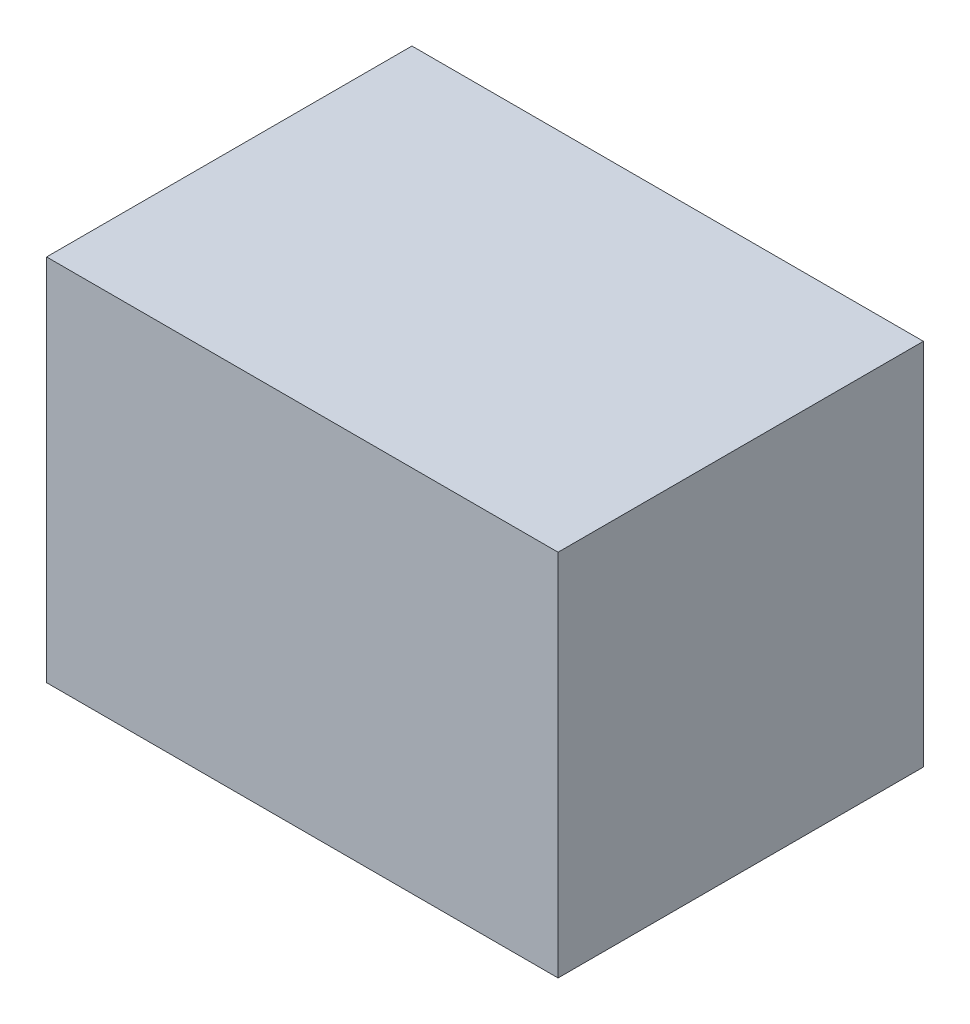
ISO-10303-21;
HEADER;
FILE_DESCRIPTION(('STEP AP214'),'2;1');
FILE_NAME('part.step','',(''),(''),'','','');
FILE_SCHEMA(('AUTOMOTIVE_DESIGN { 1 0 10303 214 1 1 1 1 }'));
ENDSEC;
DATA;
#1=APPLICATION_CONTEXT('core data for automotive mechanical design processes');
#2=APPLICATION_PROTOCOL_DEFINITION('international standard','automotive_design',2000,#1);
#3=PRODUCT_CONTEXT('',#1,'mechanical');
#4=PRODUCT('Part','Part','',(#3));
#5=PRODUCT_RELATED_PRODUCT_CATEGORY('part','',(#4));
#6=PRODUCT_DEFINITION_FORMATION('','',#4);
#7=PRODUCT_DEFINITION_CONTEXT('part definition',#1,'design');
#8=PRODUCT_DEFINITION('design','',#6,#7);
#9=PRODUCT_DEFINITION_SHAPE('','',#8);
#10=(LENGTH_UNIT() NAMED_UNIT(*) SI_UNIT(.MILLI.,.METRE.));
#11=(NAMED_UNIT(*) PLANE_ANGLE_UNIT() SI_UNIT($,.RADIAN.));
#12=(NAMED_UNIT(*) SI_UNIT($,.STERADIAN.) SOLID_ANGLE_UNIT());
#13=UNCERTAINTY_MEASURE_WITH_UNIT(LENGTH_MEASURE(1.E-05),#10,'distance_accuracy_value','');
#14=(GEOMETRIC_REPRESENTATION_CONTEXT(3) GLOBAL_UNCERTAINTY_ASSIGNED_CONTEXT((#13)) GLOBAL_UNIT_ASSIGNED_CONTEXT((#10,
#11,#12)) REPRESENTATION_CONTEXT('',''));
#15=CARTESIAN_POINT('',(0.,0.,0.));
#16=DIRECTION('',(0.,0.,1.));
#17=DIRECTION('',(1.,0.,0.));
#18=AXIS2_PLACEMENT_3D('',#15,#16,#17);
#19=CARTESIAN_POINT('',(52.5,75.7,-37.5));
#20=DIRECTION('',(-1.,0.,0.));
#21=DIRECTION('',(0.,0.,1.));
#22=AXIS2_PLACEMENT_3D('',#19,#20,#21);
#23=PLANE('',#22);
#24=DIRECTION('',(0.,0.,-1.));
#25=VECTOR('',#24,1.);
#26=CARTESIAN_POINT('',(52.5,0.,-37.5));
#27=LINE('',#26,#25);
#28=CARTESIAN_POINT('',(52.5,0.,37.5));
#29=VERTEX_POINT('',#28);
#30=CARTESIAN_POINT('',(52.5,0.,-37.5));
#31=VERTEX_POINT('',#30);
#32=EDGE_CURVE('E119',#29,#31,#27,.T.);
#33=ORIENTED_EDGE('',*,*,#32,.T.);
#34=DIRECTION('',(0.,-1.,0.));
#35=VECTOR('',#34,1.);
#36=CARTESIAN_POINT('',(52.5,75.7,-37.5));
#37=LINE('',#36,#35);
#38=CARTESIAN_POINT('',(52.5,75.7,-37.5));
#39=VERTEX_POINT('',#38);
#40=EDGE_CURVE('E11',#39,#31,#37,.T.);
#41=ORIENTED_EDGE('',*,*,#40,.F.);
#42=DIRECTION('',(0.,0.,-1.));
#43=VECTOR('',#42,1.);
#44=CARTESIAN_POINT('',(52.5,75.7,-37.5));
#45=LINE('',#44,#43);
#46=CARTESIAN_POINT('',(52.5,75.7,37.5));
#47=VERTEX_POINT('',#46);
#48=EDGE_CURVE('E102',#47,#39,#45,.T.);
#49=ORIENTED_EDGE('',*,*,#48,.F.);
#50=DIRECTION('',(0.,-1.,0.));
#51=VECTOR('',#50,1.);
#52=CARTESIAN_POINT('',(52.5,75.7,37.5));
#53=LINE('',#52,#51);
#54=EDGE_CURVE('E115',#47,#29,#53,.T.);
#55=ORIENTED_EDGE('',*,*,#54,.T.);
#56=EDGE_LOOP('',(#33,#41,#49,#55));
#57=FACE_BOUND('',#56,.T.);
#58=ADVANCED_FACE('F42',(#57),#23,.F.);
#59=CARTESIAN_POINT('',(-52.5,75.7,-37.5));
#60=DIRECTION('',(0.,0.,1.));
#61=DIRECTION('',(1.,0.,0.));
#62=AXIS2_PLACEMENT_3D('',#59,#60,#61);
#63=PLANE('',#62);
#64=DIRECTION('',(-1.,0.,0.));
#65=VECTOR('',#64,1.);
#66=CARTESIAN_POINT('',(-52.5,0.,-37.5));
#67=LINE('',#66,#65);
#68=CARTESIAN_POINT('',(-52.5,0.,-37.5));
#69=VERTEX_POINT('',#68);
#70=EDGE_CURVE('E107',#31,#69,#67,.T.);
#71=ORIENTED_EDGE('',*,*,#70,.T.);
#72=DIRECTION('',(0.,-1.,0.));
#73=VECTOR('',#72,1.);
#74=CARTESIAN_POINT('',(-52.5,75.7,-37.5));
#75=LINE('',#74,#73);
#76=CARTESIAN_POINT('',(-52.5,75.7,-37.5));
#77=VERTEX_POINT('',#76);
#78=EDGE_CURVE('E51',#77,#69,#75,.T.);
#79=ORIENTED_EDGE('',*,*,#78,.F.);
#80=DIRECTION('',(-1.,0.,0.));
#81=VECTOR('',#80,1.);
#82=CARTESIAN_POINT('',(-52.5,75.7,-37.5));
#83=LINE('',#82,#81);
#84=EDGE_CURVE('E97',#39,#77,#83,.T.);
#85=ORIENTED_EDGE('',*,*,#84,.F.);
#86=ORIENTED_EDGE('',*,*,#40,.T.);
#87=EDGE_LOOP('',(#71,#79,#85,#86));
#88=FACE_BOUND('',#87,.T.);
#89=ADVANCED_FACE('F106',(#88),#63,.F.);
#90=CARTESIAN_POINT('',(-52.5,75.7,-37.5));
#91=DIRECTION('',(1.,0.,0.));
#92=DIRECTION('',(0.,0.,-1.));
#93=AXIS2_PLACEMENT_3D('',#90,#91,#92);
#94=PLANE('',#93);
#95=DIRECTION('',(0.,0.,1.));
#96=VECTOR('',#95,1.);
#97=CARTESIAN_POINT('',(-52.5,0.,-37.5));
#98=LINE('',#97,#96);
#99=CARTESIAN_POINT('',(-52.5,0.,37.5));
#100=VERTEX_POINT('',#99);
#101=EDGE_CURVE('E82',#69,#100,#98,.T.);
#102=ORIENTED_EDGE('',*,*,#101,.T.);
#103=DIRECTION('',(0.,-1.,0.));
#104=VECTOR('',#103,1.);
#105=CARTESIAN_POINT('',(-52.5,75.7,37.5));
#106=LINE('',#105,#104);
#107=CARTESIAN_POINT('',(-52.5,75.7,37.5));
#108=VERTEX_POINT('',#107);
#109=EDGE_CURVE('E109',#108,#100,#106,.T.);
#110=ORIENTED_EDGE('',*,*,#109,.F.);
#111=DIRECTION('',(0.,0.,1.));
#112=VECTOR('',#111,1.);
#113=CARTESIAN_POINT('',(-52.5,75.7,-37.5));
#114=LINE('',#113,#112);
#115=EDGE_CURVE('E100',#77,#108,#114,.T.);
#116=ORIENTED_EDGE('',*,*,#115,.F.);
#117=ORIENTED_EDGE('',*,*,#78,.T.);
#118=EDGE_LOOP('',(#102,#110,#116,#117));
#119=FACE_BOUND('',#118,.T.);
#120=ADVANCED_FACE('F110',(#119),#94,.F.);
#121=CARTESIAN_POINT('',(-52.5,75.7,37.5));
#122=DIRECTION('',(0.,0.,-1.));
#123=DIRECTION('',(-1.,0.,0.));
#124=AXIS2_PLACEMENT_3D('',#121,#122,#123);
#125=PLANE('',#124);
#126=DIRECTION('',(1.,0.,0.));
#127=VECTOR('',#126,1.);
#128=CARTESIAN_POINT('',(-52.5,0.,37.5));
#129=LINE('',#128,#127);
#130=EDGE_CURVE('E90',#100,#29,#129,.T.);
#131=ORIENTED_EDGE('',*,*,#130,.T.);
#132=ORIENTED_EDGE('',*,*,#54,.F.);
#133=DIRECTION('',(1.,0.,0.));
#134=VECTOR('',#133,1.);
#135=CARTESIAN_POINT('',(-52.5,75.7,37.5));
#136=LINE('',#135,#134);
#137=EDGE_CURVE('E62',#108,#47,#136,.T.);
#138=ORIENTED_EDGE('',*,*,#137,.F.);
#139=ORIENTED_EDGE('',*,*,#109,.T.);
#140=EDGE_LOOP('',(#131,#132,#138,#139));
#141=FACE_BOUND('',#140,.T.);
#142=ADVANCED_FACE('F132',(#141),#125,.F.);
#143=CARTESIAN_POINT('',(0.,75.7,0.));
#144=DIRECTION('',(0.,1.,0.));
#145=DIRECTION('',(0.,0.,1.));
#146=AXIS2_PLACEMENT_3D('',#143,#144,#145);
#147=PLANE('',#146);
#148=ORIENTED_EDGE('',*,*,#48,.T.);
#149=ORIENTED_EDGE('',*,*,#84,.T.);
#150=ORIENTED_EDGE('',*,*,#115,.T.);
#151=ORIENTED_EDGE('',*,*,#137,.T.);
#152=EDGE_LOOP('',(#148,#149,#150,#151));
#153=FACE_BOUND('',#152,.T.);
#154=ADVANCED_FACE('F98',(#153),#147,.T.);
#155=CARTESIAN_POINT('',(0.,0.,0.));
#156=DIRECTION('',(0.,1.,0.));
#157=DIRECTION('',(0.,0.,1.));
#158=AXIS2_PLACEMENT_3D('',#155,#156,#157);
#159=PLANE('',#158);
#160=ORIENTED_EDGE('',*,*,#32,.F.);
#161=ORIENTED_EDGE('',*,*,#130,.F.);
#162=ORIENTED_EDGE('',*,*,#101,.F.);
#163=ORIENTED_EDGE('',*,*,#70,.F.);
#164=EDGE_LOOP('',(#160,#161,#162,#163));
#165=FACE_BOUND('',#164,.T.);
#166=ADVANCED_FACE('F135',(#165),#159,.F.);
#167=CLOSED_SHELL('',(#58,#89,#120,#142,#154,#166));
#168=MANIFOLD_SOLID_BREP('B2',#167);
#169=ADVANCED_BREP_SHAPE_REPRESENTATION('',(#18,#168),#14);
#170=SHAPE_DEFINITION_REPRESENTATION(#9,#169);
ENDSEC;
END-ISO-10303-21;
